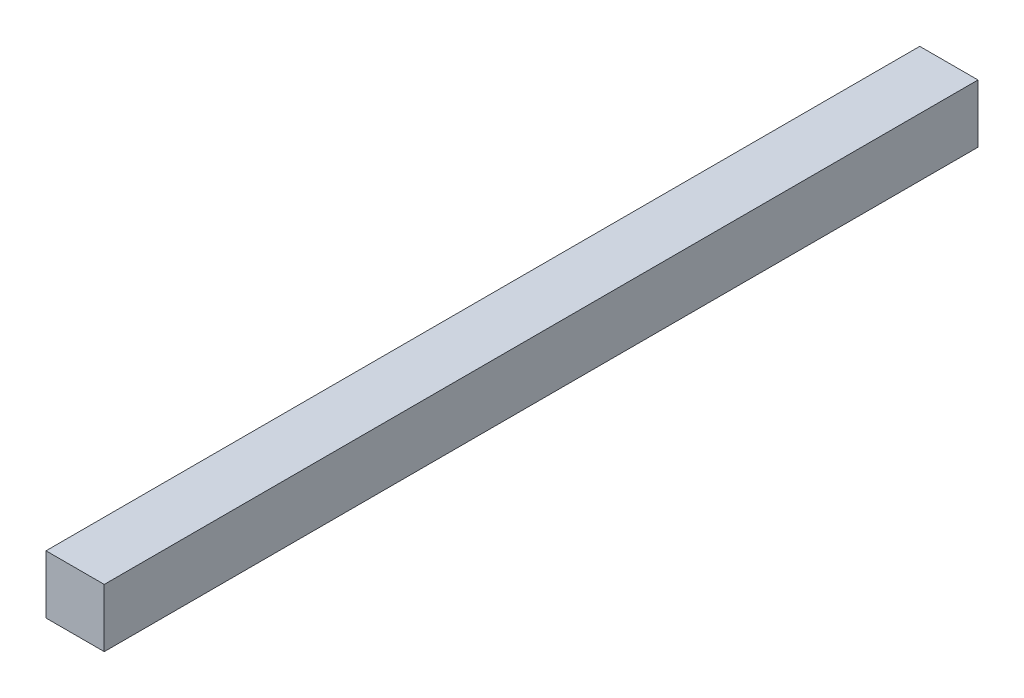
ISO-10303-21;
HEADER;
FILE_DESCRIPTION(('STEP AP214'),'2;1');
FILE_NAME('part.step','',(''),(''),'','','');
FILE_SCHEMA(('AUTOMOTIVE_DESIGN { 1 0 10303 214 1 1 1 1 }'));
ENDSEC;
DATA;
#1=APPLICATION_CONTEXT('core data for automotive mechanical design processes');
#2=APPLICATION_PROTOCOL_DEFINITION('international standard','automotive_design',2000,#1);
#3=PRODUCT_CONTEXT('',#1,'mechanical');
#4=PRODUCT('Part','Part','',(#3));
#5=PRODUCT_RELATED_PRODUCT_CATEGORY('part','',(#4));
#6=PRODUCT_DEFINITION_FORMATION('','',#4);
#7=PRODUCT_DEFINITION_CONTEXT('part definition',#1,'design');
#8=PRODUCT_DEFINITION('design','',#6,#7);
#9=PRODUCT_DEFINITION_SHAPE('','',#8);
#10=(LENGTH_UNIT() NAMED_UNIT(*) SI_UNIT(.MILLI.,.METRE.));
#11=(NAMED_UNIT(*) PLANE_ANGLE_UNIT() SI_UNIT($,.RADIAN.));
#12=(NAMED_UNIT(*) SI_UNIT($,.STERADIAN.) SOLID_ANGLE_UNIT());
#13=UNCERTAINTY_MEASURE_WITH_UNIT(LENGTH_MEASURE(1.E-05),#10,'distance_accuracy_value','');
#14=(GEOMETRIC_REPRESENTATION_CONTEXT(3) GLOBAL_UNCERTAINTY_ASSIGNED_CONTEXT((#13)) GLOBAL_UNIT_ASSIGNED_CONTEXT((#10,
#11,#12)) REPRESENTATION_CONTEXT('',''));
#15=CARTESIAN_POINT('',(0.,0.,0.));
#16=DIRECTION('',(0.,0.,1.));
#17=DIRECTION('',(1.,0.,0.));
#18=AXIS2_PLACEMENT_3D('',#15,#16,#17);
#19=CARTESIAN_POINT('',(0.,0.,300.));
#20=DIRECTION('',(1.,0.,0.));
#21=DIRECTION('',(0.,0.,-1.));
#22=AXIS2_PLACEMENT_3D('',#19,#20,#21);
#23=PLANE('',#22);
#24=DIRECTION('',(0.,-1.,0.));
#25=VECTOR('',#24,1.);
#26=CARTESIAN_POINT('',(0.,0.,0.));
#27=LINE('',#26,#25);
#28=CARTESIAN_POINT('',(0.,20.,0.));
#29=VERTEX_POINT('',#28);
#30=CARTESIAN_POINT('',(0.,0.,0.));
#31=VERTEX_POINT('',#30);
#32=EDGE_CURVE('E98',#29,#31,#27,.T.);
#33=ORIENTED_EDGE('',*,*,#32,.T.);
#34=DIRECTION('',(0.,0.,-1.));
#35=VECTOR('',#34,1.);
#36=CARTESIAN_POINT('',(0.,0.,300.));
#37=LINE('',#36,#35);
#38=CARTESIAN_POINT('',(0.,0.,300.));
#39=VERTEX_POINT('',#38);
#40=EDGE_CURVE('E11',#39,#31,#37,.T.);
#41=ORIENTED_EDGE('',*,*,#40,.F.);
#42=DIRECTION('',(0.,-1.,0.));
#43=VECTOR('',#42,1.);
#44=CARTESIAN_POINT('',(0.,0.,300.));
#45=LINE('',#44,#43);
#46=CARTESIAN_POINT('',(0.,20.,300.));
#47=VERTEX_POINT('',#46);
#48=EDGE_CURVE('E86',#47,#39,#45,.T.);
#49=ORIENTED_EDGE('',*,*,#48,.F.);
#50=DIRECTION('',(0.,0.,-1.));
#51=VECTOR('',#50,1.);
#52=CARTESIAN_POINT('',(0.,20.,300.));
#53=LINE('',#52,#51);
#54=EDGE_CURVE('E94',#47,#29,#53,.T.);
#55=ORIENTED_EDGE('',*,*,#54,.T.);
#56=EDGE_LOOP('',(#33,#41,#49,#55));
#57=FACE_BOUND('',#56,.T.);
#58=ADVANCED_FACE('F35',(#57),#23,.F.);
#59=CARTESIAN_POINT('',(0.,0.,300.));
#60=DIRECTION('',(0.,1.,0.));
#61=DIRECTION('',(0.,0.,1.));
#62=AXIS2_PLACEMENT_3D('',#59,#60,#61);
#63=PLANE('',#62);
#64=DIRECTION('',(1.,0.,0.));
#65=VECTOR('',#64,1.);
#66=CARTESIAN_POINT('',(0.,0.,0.));
#67=LINE('',#66,#65);
#68=CARTESIAN_POINT('',(20.,0.,0.));
#69=VERTEX_POINT('',#68);
#70=EDGE_CURVE('E90',#31,#69,#67,.T.);
#71=ORIENTED_EDGE('',*,*,#70,.T.);
#72=DIRECTION('',(0.,0.,-1.));
#73=VECTOR('',#72,1.);
#74=CARTESIAN_POINT('',(20.,0.,300.));
#75=LINE('',#74,#73);
#76=CARTESIAN_POINT('',(20.,0.,300.));
#77=VERTEX_POINT('',#76);
#78=EDGE_CURVE('E43',#77,#69,#75,.T.);
#79=ORIENTED_EDGE('',*,*,#78,.F.);
#80=DIRECTION('',(1.,0.,0.));
#81=VECTOR('',#80,1.);
#82=CARTESIAN_POINT('',(0.,0.,300.));
#83=LINE('',#82,#81);
#84=EDGE_CURVE('E81',#39,#77,#83,.T.);
#85=ORIENTED_EDGE('',*,*,#84,.F.);
#86=ORIENTED_EDGE('',*,*,#40,.T.);
#87=EDGE_LOOP('',(#71,#79,#85,#86));
#88=FACE_BOUND('',#87,.T.);
#89=ADVANCED_FACE('F89',(#88),#63,.F.);
#90=CARTESIAN_POINT('',(20.,0.,300.));
#91=DIRECTION('',(-1.,0.,0.));
#92=DIRECTION('',(0.,0.,1.));
#93=AXIS2_PLACEMENT_3D('',#90,#91,#92);
#94=PLANE('',#93);
#95=DIRECTION('',(0.,1.,0.));
#96=VECTOR('',#95,1.);
#97=CARTESIAN_POINT('',(20.,0.,0.));
#98=LINE('',#97,#96);
#99=CARTESIAN_POINT('',(20.,20.,0.));
#100=VERTEX_POINT('',#99);
#101=EDGE_CURVE('E68',#69,#100,#98,.T.);
#102=ORIENTED_EDGE('',*,*,#101,.T.);
#103=DIRECTION('',(0.,0.,-1.));
#104=VECTOR('',#103,1.);
#105=CARTESIAN_POINT('',(20.,20.,300.));
#106=LINE('',#105,#104);
#107=CARTESIAN_POINT('',(20.,20.,300.));
#108=VERTEX_POINT('',#107);
#109=EDGE_CURVE('E91',#108,#100,#106,.T.);
#110=ORIENTED_EDGE('',*,*,#109,.F.);
#111=DIRECTION('',(0.,1.,0.));
#112=VECTOR('',#111,1.);
#113=CARTESIAN_POINT('',(20.,0.,300.));
#114=LINE('',#113,#112);
#115=EDGE_CURVE('E84',#77,#108,#114,.T.);
#116=ORIENTED_EDGE('',*,*,#115,.F.);
#117=ORIENTED_EDGE('',*,*,#78,.T.);
#118=EDGE_LOOP('',(#102,#110,#116,#117));
#119=FACE_BOUND('',#118,.T.);
#120=ADVANCED_FACE('F92',(#119),#94,.F.);
#121=CARTESIAN_POINT('',(0.,20.,300.));
#122=DIRECTION('',(0.,-1.,0.));
#123=DIRECTION('',(0.,0.,-1.));
#124=AXIS2_PLACEMENT_3D('',#121,#122,#123);
#125=PLANE('',#124);
#126=DIRECTION('',(-1.,0.,0.));
#127=VECTOR('',#126,1.);
#128=CARTESIAN_POINT('',(0.,20.,0.));
#129=LINE('',#128,#127);
#130=EDGE_CURVE('E74',#100,#29,#129,.T.);
#131=ORIENTED_EDGE('',*,*,#130,.T.);
#132=ORIENTED_EDGE('',*,*,#54,.F.);
#133=DIRECTION('',(-1.,0.,0.));
#134=VECTOR('',#133,1.);
#135=CARTESIAN_POINT('',(0.,20.,300.));
#136=LINE('',#135,#134);
#137=EDGE_CURVE('E51',#108,#47,#136,.T.);
#138=ORIENTED_EDGE('',*,*,#137,.F.);
#139=ORIENTED_EDGE('',*,*,#109,.T.);
#140=EDGE_LOOP('',(#131,#132,#138,#139));
#141=FACE_BOUND('',#140,.T.);
#142=ADVANCED_FACE('F105',(#141),#125,.F.);
#143=CARTESIAN_POINT('',(0.,0.,300.));
#144=DIRECTION('',(0.,0.,-1.));
#145=DIRECTION('',(-1.,0.,0.));
#146=AXIS2_PLACEMENT_3D('',#143,#144,#145);
#147=PLANE('',#146);
#148=ORIENTED_EDGE('',*,*,#48,.T.);
#149=ORIENTED_EDGE('',*,*,#84,.T.);
#150=ORIENTED_EDGE('',*,*,#115,.T.);
#151=ORIENTED_EDGE('',*,*,#137,.T.);
#152=EDGE_LOOP('',(#148,#149,#150,#151));
#153=FACE_BOUND('',#152,.T.);
#154=ADVANCED_FACE('F82',(#153),#147,.F.);
#155=CARTESIAN_POINT('',(0.,0.,0.));
#156=DIRECTION('',(0.,0.,-1.));
#157=DIRECTION('',(-1.,0.,0.));
#158=AXIS2_PLACEMENT_3D('',#155,#156,#157);
#159=PLANE('',#158);
#160=ORIENTED_EDGE('',*,*,#32,.F.);
#161=ORIENTED_EDGE('',*,*,#130,.F.);
#162=ORIENTED_EDGE('',*,*,#101,.F.);
#163=ORIENTED_EDGE('',*,*,#70,.F.);
#164=EDGE_LOOP('',(#160,#161,#162,#163));
#165=FACE_BOUND('',#164,.T.);
#166=ADVANCED_FACE('F108',(#165),#159,.T.);
#167=CLOSED_SHELL('',(#58,#89,#120,#142,#154,#166));
#168=MANIFOLD_SOLID_BREP('B2',#167);
#169=ADVANCED_BREP_SHAPE_REPRESENTATION('',(#18,#168),#14);
#170=SHAPE_DEFINITION_REPRESENTATION(#9,#169);
ENDSEC;
END-ISO-10303-21;
